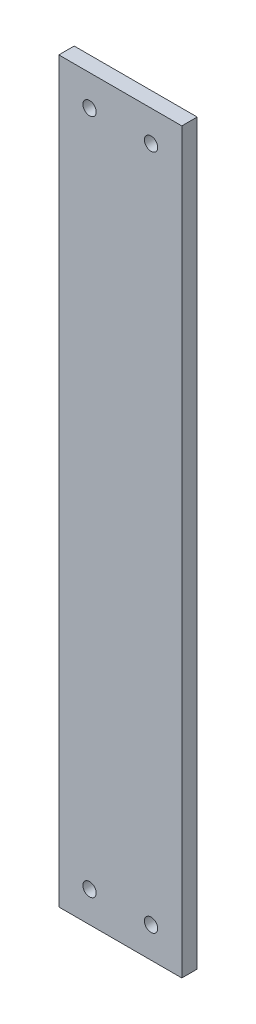
ISO-10303-21;
HEADER;
FILE_DESCRIPTION(('STEP AP214'),'2;1');
FILE_NAME('part.step','',(''),(''),'','','');
FILE_SCHEMA(('AUTOMOTIVE_DESIGN { 1 0 10303 214 1 1 1 1 }'));
ENDSEC;
DATA;
#1=APPLICATION_CONTEXT('core data for automotive mechanical design processes');
#2=APPLICATION_PROTOCOL_DEFINITION('international standard','automotive_design',2000,#1);
#3=PRODUCT_CONTEXT('',#1,'mechanical');
#4=PRODUCT('Part','Part','',(#3));
#5=PRODUCT_RELATED_PRODUCT_CATEGORY('part','',(#4));
#6=PRODUCT_DEFINITION_FORMATION('','',#4);
#7=PRODUCT_DEFINITION_CONTEXT('part definition',#1,'design');
#8=PRODUCT_DEFINITION('design','',#6,#7);
#9=PRODUCT_DEFINITION_SHAPE('','',#8);
#10=(LENGTH_UNIT() NAMED_UNIT(*) SI_UNIT(.MILLI.,.METRE.));
#11=(NAMED_UNIT(*) PLANE_ANGLE_UNIT() SI_UNIT($,.RADIAN.));
#12=(NAMED_UNIT(*) SI_UNIT($,.STERADIAN.) SOLID_ANGLE_UNIT());
#13=UNCERTAINTY_MEASURE_WITH_UNIT(LENGTH_MEASURE(1.E-05),#10,'distance_accuracy_value','');
#14=(GEOMETRIC_REPRESENTATION_CONTEXT(3) GLOBAL_UNCERTAINTY_ASSIGNED_CONTEXT((#13)) GLOBAL_UNIT_ASSIGNED_CONTEXT((#10,
#11,#12)) REPRESENTATION_CONTEXT('',''));
#15=CARTESIAN_POINT('',(0.,0.,0.));
#16=DIRECTION('',(0.,0.,1.));
#17=DIRECTION('',(1.,0.,0.));
#18=AXIS2_PLACEMENT_3D('',#15,#16,#17);
#19=CARTESIAN_POINT('',(25.4,152.4,6.35));
#20=DIRECTION('',(-1.,0.,0.));
#21=DIRECTION('',(0.,-1.,0.));
#22=AXIS2_PLACEMENT_3D('',#19,#20,#21);
#23=PLANE('',#22);
#24=DIRECTION('',(0.,1.,0.));
#25=VECTOR('',#24,1.);
#26=CARTESIAN_POINT('',(25.4,152.4,0.));
#27=LINE('',#26,#25);
#28=CARTESIAN_POINT('',(25.4,-152.4,0.));
#29=VERTEX_POINT('',#28);
#30=CARTESIAN_POINT('',(25.4,152.4,0.));
#31=VERTEX_POINT('',#30);
#32=EDGE_CURVE('E101',#29,#31,#27,.T.);
#33=ORIENTED_EDGE('',*,*,#32,.T.);
#34=DIRECTION('',(0.,0.,-1.));
#35=VECTOR('',#34,1.);
#36=CARTESIAN_POINT('',(25.4,152.4,6.35));
#37=LINE('',#36,#35);
#38=CARTESIAN_POINT('',(25.4,152.4,6.35));
#39=VERTEX_POINT('',#38);
#40=EDGE_CURVE('E11',#39,#31,#37,.T.);
#41=ORIENTED_EDGE('',*,*,#40,.F.);
#42=DIRECTION('',(0.,1.,0.));
#43=VECTOR('',#42,1.);
#44=CARTESIAN_POINT('',(25.4,152.4,6.35));
#45=LINE('',#44,#43);
#46=CARTESIAN_POINT('',(25.4,-152.4,6.35));
#47=VERTEX_POINT('',#46);
#48=EDGE_CURVE('E89',#47,#39,#45,.T.);
#49=ORIENTED_EDGE('',*,*,#48,.F.);
#50=DIRECTION('',(0.,0.,-1.));
#51=VECTOR('',#50,1.);
#52=CARTESIAN_POINT('',(25.4,-152.4,6.35));
#53=LINE('',#52,#51);
#54=EDGE_CURVE('E97',#47,#29,#53,.T.);
#55=ORIENTED_EDGE('',*,*,#54,.T.);
#56=EDGE_LOOP('',(#33,#41,#49,#55));
#57=FACE_BOUND('',#56,.T.);
#58=ADVANCED_FACE('F38',(#57),#23,.F.);
#59=CARTESIAN_POINT('',(-25.4,152.4,6.35));
#60=DIRECTION('',(0.,-1.,0.));
#61=DIRECTION('',(0.,0.,-1.));
#62=AXIS2_PLACEMENT_3D('',#59,#60,#61);
#63=PLANE('',#62);
#64=DIRECTION('',(-1.,0.,0.));
#65=VECTOR('',#64,1.);
#66=CARTESIAN_POINT('',(-25.4,152.4,0.));
#67=LINE('',#66,#65);
#68=CARTESIAN_POINT('',(-25.4,152.4,0.));
#69=VERTEX_POINT('',#68);
#70=EDGE_CURVE('E93',#31,#69,#67,.T.);
#71=ORIENTED_EDGE('',*,*,#70,.T.);
#72=DIRECTION('',(0.,0.,-1.));
#73=VECTOR('',#72,1.);
#74=CARTESIAN_POINT('',(-25.4,152.4,6.35));
#75=LINE('',#74,#73);
#76=CARTESIAN_POINT('',(-25.4,152.4,6.35));
#77=VERTEX_POINT('',#76);
#78=EDGE_CURVE('E46',#77,#69,#75,.T.);
#79=ORIENTED_EDGE('',*,*,#78,.F.);
#80=DIRECTION('',(-1.,0.,0.));
#81=VECTOR('',#80,1.);
#82=CARTESIAN_POINT('',(-25.4,152.4,6.35));
#83=LINE('',#82,#81);
#84=EDGE_CURVE('E84',#39,#77,#83,.T.);
#85=ORIENTED_EDGE('',*,*,#84,.F.);
#86=ORIENTED_EDGE('',*,*,#40,.T.);
#87=EDGE_LOOP('',(#71,#79,#85,#86));
#88=FACE_BOUND('',#87,.T.);
#89=ADVANCED_FACE('F92',(#88),#63,.F.);
#90=CARTESIAN_POINT('',(-25.4,152.4,6.35));
#91=DIRECTION('',(1.,0.,0.));
#92=DIRECTION('',(0.,1.,0.));
#93=AXIS2_PLACEMENT_3D('',#90,#91,#92);
#94=PLANE('',#93);
#95=DIRECTION('',(0.,-1.,0.));
#96=VECTOR('',#95,1.);
#97=CARTESIAN_POINT('',(-25.4,152.4,0.));
#98=LINE('',#97,#96);
#99=CARTESIAN_POINT('',(-25.4,-152.4,0.));
#100=VERTEX_POINT('',#99);
#101=EDGE_CURVE('E71',#69,#100,#98,.T.);
#102=ORIENTED_EDGE('',*,*,#101,.T.);
#103=DIRECTION('',(0.,0.,-1.));
#104=VECTOR('',#103,1.);
#105=CARTESIAN_POINT('',(-25.4,-152.4,6.35));
#106=LINE('',#105,#104);
#107=CARTESIAN_POINT('',(-25.4,-152.4,6.35));
#108=VERTEX_POINT('',#107);
#109=EDGE_CURVE('E94',#108,#100,#106,.T.);
#110=ORIENTED_EDGE('',*,*,#109,.F.);
#111=DIRECTION('',(0.,-1.,0.));
#112=VECTOR('',#111,1.);
#113=CARTESIAN_POINT('',(-25.4,152.4,6.35));
#114=LINE('',#113,#112);
#115=EDGE_CURVE('E87',#77,#108,#114,.T.);
#116=ORIENTED_EDGE('',*,*,#115,.F.);
#117=ORIENTED_EDGE('',*,*,#78,.T.);
#118=EDGE_LOOP('',(#102,#110,#116,#117));
#119=FACE_BOUND('',#118,.T.);
#120=ADVANCED_FACE('F95',(#119),#94,.F.);
#121=CARTESIAN_POINT('',(-25.4,-152.4,6.35));
#122=DIRECTION('',(0.,1.,0.));
#123=DIRECTION('',(0.,0.,1.));
#124=AXIS2_PLACEMENT_3D('',#121,#122,#123);
#125=PLANE('',#124);
#126=DIRECTION('',(1.,0.,0.));
#127=VECTOR('',#126,1.);
#128=CARTESIAN_POINT('',(-25.4,-152.4,0.));
#129=LINE('',#128,#127);
#130=EDGE_CURVE('E77',#100,#29,#129,.T.);
#131=ORIENTED_EDGE('',*,*,#130,.T.);
#132=ORIENTED_EDGE('',*,*,#54,.F.);
#133=DIRECTION('',(1.,0.,0.));
#134=VECTOR('',#133,1.);
#135=CARTESIAN_POINT('',(-25.4,-152.4,6.35));
#136=LINE('',#135,#134);
#137=EDGE_CURVE('E54',#108,#47,#136,.T.);
#138=ORIENTED_EDGE('',*,*,#137,.F.);
#139=ORIENTED_EDGE('',*,*,#109,.T.);
#140=EDGE_LOOP('',(#131,#132,#138,#139));
#141=FACE_BOUND('',#140,.T.);
#142=ADVANCED_FACE('F109',(#141),#125,.F.);
#143=CARTESIAN_POINT('',(0.,0.,6.35));
#144=DIRECTION('',(0.,0.,1.));
#145=DIRECTION('',(1.,0.,0.));
#146=AXIS2_PLACEMENT_3D('',#143,#144,#145);
#147=PLANE('',#146);
#148=CARTESIAN_POINT('',(-12.7,139.7,6.35));
#149=DIRECTION('',(0.,0.,1.));
#150=DIRECTION('',(1.,0.,0.));
#151=AXIS2_PLACEMENT_3D('',#148,#149,#150);
#152=CIRCLE('',#151,2.75);
#153=CARTESIAN_POINT('',(-9.95000000000003,139.7,6.35));
#154=VERTEX_POINT('',#153);
#155=EDGE_CURVE('E128',#154,#154,#152,.T.);
#156=ORIENTED_EDGE('',*,*,#155,.F.);
#157=EDGE_LOOP('',(#156));
#158=FACE_BOUND('',#157,.T.);
#159=CARTESIAN_POINT('',(12.7,-139.7,6.35));
#160=DIRECTION('',(0.,0.,1.));
#161=DIRECTION('',(-1.,0.,0.));
#162=AXIS2_PLACEMENT_3D('',#159,#160,#161);
#163=CIRCLE('',#162,2.75);
#164=CARTESIAN_POINT('',(9.95,-139.7,6.35));
#165=VERTEX_POINT('',#164);
#166=EDGE_CURVE('E121',#165,#165,#163,.T.);
#167=ORIENTED_EDGE('',*,*,#166,.F.);
#168=EDGE_LOOP('',(#167));
#169=FACE_BOUND('',#168,.T.);
#170=CARTESIAN_POINT('',(-12.7,-139.7,6.35));
#171=DIRECTION('',(0.,0.,1.));
#172=DIRECTION('',(-1.,0.,0.));
#173=AXIS2_PLACEMENT_3D('',#170,#171,#172);
#174=CIRCLE('',#173,2.75);
#175=CARTESIAN_POINT('',(-15.45,-139.7,6.35));
#176=VERTEX_POINT('',#175);
#177=EDGE_CURVE('E133',#176,#176,#174,.T.);
#178=ORIENTED_EDGE('',*,*,#177,.F.);
#179=EDGE_LOOP('',(#178));
#180=FACE_BOUND('',#179,.T.);
#181=CARTESIAN_POINT('',(12.7,139.7,6.35));
#182=DIRECTION('',(0.,0.,1.));
#183=DIRECTION('',(1.,0.,0.));
#184=AXIS2_PLACEMENT_3D('',#181,#182,#183);
#185=CIRCLE('',#184,2.75);
#186=CARTESIAN_POINT('',(15.45,139.7,6.35));
#187=VERTEX_POINT('',#186);
#188=EDGE_CURVE('E115',#187,#187,#185,.T.);
#189=ORIENTED_EDGE('',*,*,#188,.F.);
#190=EDGE_LOOP('',(#189));
#191=FACE_BOUND('',#190,.T.);
#192=ORIENTED_EDGE('',*,*,#48,.T.);
#193=ORIENTED_EDGE('',*,*,#84,.T.);
#194=ORIENTED_EDGE('',*,*,#115,.T.);
#195=ORIENTED_EDGE('',*,*,#137,.T.);
#196=EDGE_LOOP('',(#192,#193,#194,#195));
#197=FACE_BOUND('',#196,.T.);
#198=ADVANCED_FACE('F85',(#158,#169,#180,#191,#197),#147,.T.);
#199=CARTESIAN_POINT('',(0.,0.,0.));
#200=DIRECTION('',(0.,0.,1.));
#201=DIRECTION('',(1.,0.,0.));
#202=AXIS2_PLACEMENT_3D('',#199,#200,#201);
#203=PLANE('',#202);
#204=CARTESIAN_POINT('',(-12.7,139.7,0.));
#205=DIRECTION('',(0.,0.,1.));
#206=DIRECTION('',(1.,0.,0.));
#207=AXIS2_PLACEMENT_3D('',#204,#205,#206);
#208=CIRCLE('',#207,2.75);
#209=CARTESIAN_POINT('',(-9.95000000000003,139.7,0.));
#210=VERTEX_POINT('',#209);
#211=EDGE_CURVE('E118',#210,#210,#208,.T.);
#212=ORIENTED_EDGE('',*,*,#211,.T.);
#213=EDGE_LOOP('',(#212));
#214=FACE_BOUND('',#213,.T.);
#215=CARTESIAN_POINT('',(12.7,-139.7,0.));
#216=DIRECTION('',(0.,0.,1.));
#217=DIRECTION('',(-1.,0.,0.));
#218=AXIS2_PLACEMENT_3D('',#215,#216,#217);
#219=CIRCLE('',#218,2.75);
#220=CARTESIAN_POINT('',(9.95,-139.7,0.));
#221=VERTEX_POINT('',#220);
#222=EDGE_CURVE('E124',#221,#221,#219,.T.);
#223=ORIENTED_EDGE('',*,*,#222,.T.);
#224=EDGE_LOOP('',(#223));
#225=FACE_BOUND('',#224,.T.);
#226=CARTESIAN_POINT('',(-12.7,-139.7,0.));
#227=DIRECTION('',(0.,0.,1.));
#228=DIRECTION('',(-1.,0.,0.));
#229=AXIS2_PLACEMENT_3D('',#226,#227,#228);
#230=CIRCLE('',#229,2.75);
#231=CARTESIAN_POINT('',(-15.45,-139.7,0.));
#232=VERTEX_POINT('',#231);
#233=EDGE_CURVE('E125',#232,#232,#230,.T.);
#234=ORIENTED_EDGE('',*,*,#233,.T.);
#235=EDGE_LOOP('',(#234));
#236=FACE_BOUND('',#235,.T.);
#237=CARTESIAN_POINT('',(12.7,139.7,0.));
#238=DIRECTION('',(0.,0.,1.));
#239=DIRECTION('',(1.,0.,0.));
#240=AXIS2_PLACEMENT_3D('',#237,#238,#239);
#241=CIRCLE('',#240,2.75);
#242=CARTESIAN_POINT('',(15.45,139.7,0.));
#243=VERTEX_POINT('',#242);
#244=EDGE_CURVE('E104',#243,#243,#241,.T.);
#245=ORIENTED_EDGE('',*,*,#244,.T.);
#246=EDGE_LOOP('',(#245));
#247=FACE_BOUND('',#246,.T.);
#248=ORIENTED_EDGE('',*,*,#32,.F.);
#249=ORIENTED_EDGE('',*,*,#130,.F.);
#250=ORIENTED_EDGE('',*,*,#101,.F.);
#251=ORIENTED_EDGE('',*,*,#70,.F.);
#252=EDGE_LOOP('',(#248,#249,#250,#251));
#253=FACE_BOUND('',#252,.T.);
#254=ADVANCED_FACE('F112',(#214,#225,#236,#247,#253),#203,.F.);
#255=CARTESIAN_POINT('',(12.7,139.7,0.));
#256=DIRECTION('',(0.,0.,1.));
#257=DIRECTION('',(1.,0.,0.));
#258=AXIS2_PLACEMENT_3D('',#255,#256,#257);
#259=CYLINDRICAL_SURFACE('',#258,2.75);
#260=ORIENTED_EDGE('',*,*,#244,.F.);
#261=EDGE_LOOP('',(#260));
#262=FACE_BOUND('',#261,.T.);
#263=ORIENTED_EDGE('',*,*,#188,.T.);
#264=EDGE_LOOP('',(#263));
#265=FACE_BOUND('',#264,.T.);
#266=ADVANCED_FACE('F145',(#262,#265),#259,.F.);
#267=CARTESIAN_POINT('',(-12.7,-139.7,0.));
#268=DIRECTION('',(0.,0.,1.));
#269=DIRECTION('',(1.,0.,0.));
#270=AXIS2_PLACEMENT_3D('',#267,#268,#269);
#271=CYLINDRICAL_SURFACE('',#270,2.75);
#272=ORIENTED_EDGE('',*,*,#233,.F.);
#273=EDGE_LOOP('',(#272));
#274=FACE_BOUND('',#273,.T.);
#275=ORIENTED_EDGE('',*,*,#177,.T.);
#276=EDGE_LOOP('',(#275));
#277=FACE_BOUND('',#276,.T.);
#278=ADVANCED_FACE('F141',(#274,#277),#271,.F.);
#279=CARTESIAN_POINT('',(12.7,-139.7,0.));
#280=DIRECTION('',(0.,0.,1.));
#281=DIRECTION('',(1.,0.,0.));
#282=AXIS2_PLACEMENT_3D('',#279,#280,#281);
#283=CYLINDRICAL_SURFACE('',#282,2.75);
#284=ORIENTED_EDGE('',*,*,#222,.F.);
#285=EDGE_LOOP('',(#284));
#286=FACE_BOUND('',#285,.T.);
#287=ORIENTED_EDGE('',*,*,#166,.T.);
#288=EDGE_LOOP('',(#287));
#289=FACE_BOUND('',#288,.T.);
#290=ADVANCED_FACE('F144',(#286,#289),#283,.F.);
#291=CARTESIAN_POINT('',(-12.7,139.7,0.));
#292=DIRECTION('',(0.,0.,1.));
#293=DIRECTION('',(1.,0.,0.));
#294=AXIS2_PLACEMENT_3D('',#291,#292,#293);
#295=CYLINDRICAL_SURFACE('',#294,2.75);
#296=ORIENTED_EDGE('',*,*,#211,.F.);
#297=EDGE_LOOP('',(#296));
#298=FACE_BOUND('',#297,.T.);
#299=ORIENTED_EDGE('',*,*,#155,.T.);
#300=EDGE_LOOP('',(#299));
#301=FACE_BOUND('',#300,.T.);
#302=ADVANCED_FACE('F208',(#298,#301),#295,.F.);
#303=CLOSED_SHELL('',(#58,#89,#120,#142,#198,#254,#266,#278,#290,#302));
#304=MANIFOLD_SOLID_BREP('B2',#303);
#305=ADVANCED_BREP_SHAPE_REPRESENTATION('',(#18,#304),#14);
#306=SHAPE_DEFINITION_REPRESENTATION(#9,#305);
ENDSEC;
END-ISO-10303-21;
